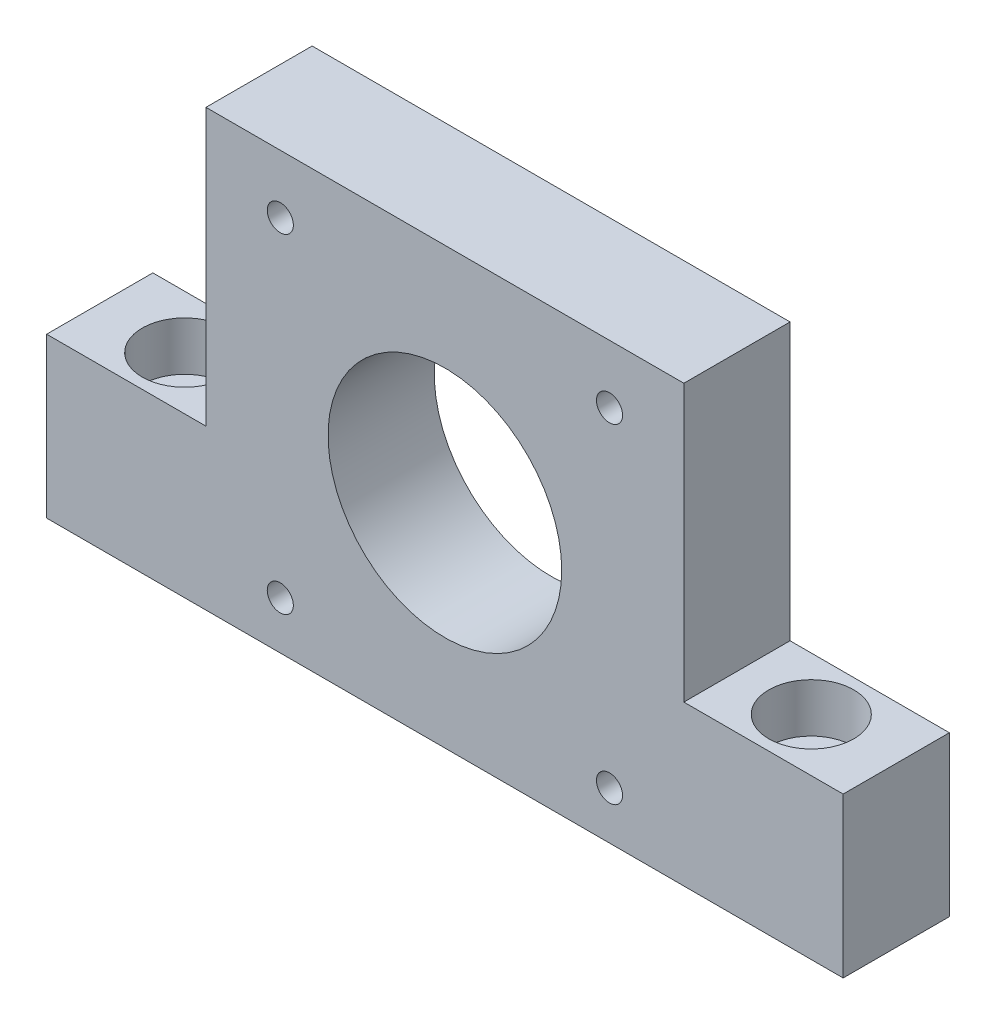
ISO-10303-21;
HEADER;
FILE_DESCRIPTION(('STEP AP214'),'2;1');
FILE_NAME('part.step','',(''),(''),'','','');
FILE_SCHEMA(('AUTOMOTIVE_DESIGN { 1 0 10303 214 1 1 1 1 }'));
ENDSEC;
DATA;
#1=APPLICATION_CONTEXT('core data for automotive mechanical design processes');
#2=APPLICATION_PROTOCOL_DEFINITION('international standard','automotive_design',2000,#1);
#3=PRODUCT_CONTEXT('',#1,'mechanical');
#4=PRODUCT('Part','Part','',(#3));
#5=PRODUCT_RELATED_PRODUCT_CATEGORY('part','',(#4));
#6=PRODUCT_DEFINITION_FORMATION('','',#4);
#7=PRODUCT_DEFINITION_CONTEXT('part definition',#1,'design');
#8=PRODUCT_DEFINITION('design','',#6,#7);
#9=PRODUCT_DEFINITION_SHAPE('','',#8);
#10=(LENGTH_UNIT() NAMED_UNIT(*) SI_UNIT(.MILLI.,.METRE.));
#11=(NAMED_UNIT(*) PLANE_ANGLE_UNIT() SI_UNIT($,.RADIAN.));
#12=(NAMED_UNIT(*) SI_UNIT($,.STERADIAN.) SOLID_ANGLE_UNIT());
#13=UNCERTAINTY_MEASURE_WITH_UNIT(LENGTH_MEASURE(1.E-05),#10,'distance_accuracy_value','');
#14=(GEOMETRIC_REPRESENTATION_CONTEXT(3) GLOBAL_UNCERTAINTY_ASSIGNED_CONTEXT((#13)) GLOBAL_UNIT_ASSIGNED_CONTEXT((#10,
#11,#12)) REPRESENTATION_CONTEXT('',''));
#15=CARTESIAN_POINT('',(0.,0.,0.));
#16=DIRECTION('',(0.,0.,1.));
#17=DIRECTION('',(1.,0.,0.));
#18=AXIS2_PLACEMENT_3D('',#15,#16,#17);
#19=CARTESIAN_POINT('',(0.,15.,10.));
#20=DIRECTION('',(1.,0.,0.));
#21=DIRECTION('',(0.,1.,0.));
#22=AXIS2_PLACEMENT_3D('',#19,#20,#21);
#23=PLANE('',#22);
#24=DIRECTION('',(0.,-1.,0.));
#25=VECTOR('',#24,1.);
#26=CARTESIAN_POINT('',(0.,15.,0.));
#27=LINE('',#26,#25);
#28=CARTESIAN_POINT('',(0.,15.,0.));
#29=VERTEX_POINT('',#28);
#30=CARTESIAN_POINT('',(0.,0.,0.));
#31=VERTEX_POINT('',#30);
#32=EDGE_CURVE('E135',#29,#31,#27,.T.);
#33=ORIENTED_EDGE('',*,*,#32,.T.);
#34=DIRECTION('',(0.,0.,-1.));
#35=VECTOR('',#34,1.);
#36=CARTESIAN_POINT('',(0.,0.,10.));
#37=LINE('',#36,#35);
#38=CARTESIAN_POINT('',(0.,0.,10.));
#39=VERTEX_POINT('',#38);
#40=EDGE_CURVE('E11',#39,#31,#37,.T.);
#41=ORIENTED_EDGE('',*,*,#40,.F.);
#42=DIRECTION('',(0.,-1.,0.));
#43=VECTOR('',#42,1.);
#44=CARTESIAN_POINT('',(0.,15.,10.));
#45=LINE('',#44,#43);
#46=CARTESIAN_POINT('',(0.,15.,10.));
#47=VERTEX_POINT('',#46);
#48=EDGE_CURVE('E150',#47,#39,#45,.T.);
#49=ORIENTED_EDGE('',*,*,#48,.F.);
#50=DIRECTION('',(0.,0.,-1.));
#51=VECTOR('',#50,1.);
#52=CARTESIAN_POINT('',(0.,15.,10.));
#53=LINE('',#52,#51);
#54=EDGE_CURVE('E131',#47,#29,#53,.T.);
#55=ORIENTED_EDGE('',*,*,#54,.T.);
#56=EDGE_LOOP('',(#33,#41,#49,#55));
#57=FACE_BOUND('',#56,.T.);
#58=ADVANCED_FACE('F39',(#57),#23,.F.);
#59=CARTESIAN_POINT('',(0.,0.,10.));
#60=DIRECTION('',(0.,1.,0.));
#61=DIRECTION('',(0.,0.,1.));
#62=AXIS2_PLACEMENT_3D('',#59,#60,#61);
#63=PLANE('',#62);
#64=CARTESIAN_POINT('',(7.99999999999999,0.,5.));
#65=DIRECTION('',(0.,1.,0.));
#66=DIRECTION('',(0.,0.,1.));
#67=AXIS2_PLACEMENT_3D('',#64,#65,#66);
#68=CIRCLE('',#67,2.25);
#69=CARTESIAN_POINT('',(7.99999999999999,0.,7.25));
#70=VERTEX_POINT('',#69);
#71=EDGE_CURVE('E200',#70,#70,#68,.T.);
#72=ORIENTED_EDGE('',*,*,#71,.T.);
#73=EDGE_LOOP('',(#72));
#74=FACE_BOUND('',#73,.T.);
#75=CARTESIAN_POINT('',(67.,0.,5.));
#76=DIRECTION('',(0.,1.,0.));
#77=DIRECTION('',(0.,0.,1.));
#78=AXIS2_PLACEMENT_3D('',#75,#76,#77);
#79=CIRCLE('',#78,2.25);
#80=CARTESIAN_POINT('',(67.,0.,7.25));
#81=VERTEX_POINT('',#80);
#82=EDGE_CURVE('E186',#81,#81,#79,.T.);
#83=ORIENTED_EDGE('',*,*,#82,.T.);
#84=EDGE_LOOP('',(#83));
#85=FACE_BOUND('',#84,.T.);
#86=DIRECTION('',(1.,0.,0.));
#87=VECTOR('',#86,1.);
#88=CARTESIAN_POINT('',(0.,0.,0.));
#89=LINE('',#88,#87);
#90=CARTESIAN_POINT('',(75.,0.,0.));
#91=VERTEX_POINT('',#90);
#92=EDGE_CURVE('E138',#31,#91,#89,.T.);
#93=ORIENTED_EDGE('',*,*,#92,.T.);
#94=DIRECTION('',(0.,0.,-1.));
#95=VECTOR('',#94,1.);
#96=CARTESIAN_POINT('',(75.,0.,10.));
#97=LINE('',#96,#95);
#98=CARTESIAN_POINT('',(75.,0.,10.));
#99=VERTEX_POINT('',#98);
#100=EDGE_CURVE('E47',#99,#91,#97,.T.);
#101=ORIENTED_EDGE('',*,*,#100,.F.);
#102=DIRECTION('',(1.,0.,0.));
#103=VECTOR('',#102,1.);
#104=CARTESIAN_POINT('',(0.,0.,10.));
#105=LINE('',#104,#103);
#106=EDGE_CURVE('E98',#39,#99,#105,.T.);
#107=ORIENTED_EDGE('',*,*,#106,.F.);
#108=ORIENTED_EDGE('',*,*,#40,.T.);
#109=EDGE_LOOP('',(#93,#101,#107,#108));
#110=FACE_BOUND('',#109,.T.);
#111=ADVANCED_FACE('F265',(#74,#85,#110),#63,.F.);
#112=CARTESIAN_POINT('',(75.,0.,10.));
#113=DIRECTION('',(-1.,0.,0.));
#114=DIRECTION('',(0.,0.,1.));
#115=AXIS2_PLACEMENT_3D('',#112,#113,#114);
#116=PLANE('',#115);
#117=DIRECTION('',(0.,1.,0.));
#118=VECTOR('',#117,1.);
#119=CARTESIAN_POINT('',(75.,0.,0.));
#120=LINE('',#119,#118);
#121=CARTESIAN_POINT('',(75.,15.,0.));
#122=VERTEX_POINT('',#121);
#123=EDGE_CURVE('E141',#91,#122,#120,.T.);
#124=ORIENTED_EDGE('',*,*,#123,.T.);
#125=DIRECTION('',(0.,0.,-1.));
#126=VECTOR('',#125,1.);
#127=CARTESIAN_POINT('',(75.,15.,10.));
#128=LINE('',#127,#126);
#129=CARTESIAN_POINT('',(75.,15.,10.));
#130=VERTEX_POINT('',#129);
#131=EDGE_CURVE('E157',#130,#122,#128,.T.);
#132=ORIENTED_EDGE('',*,*,#131,.F.);
#133=DIRECTION('',(0.,1.,0.));
#134=VECTOR('',#133,1.);
#135=CARTESIAN_POINT('',(75.,0.,10.));
#136=LINE('',#135,#134);
#137=EDGE_CURVE('E165',#99,#130,#136,.T.);
#138=ORIENTED_EDGE('',*,*,#137,.F.);
#139=ORIENTED_EDGE('',*,*,#100,.T.);
#140=EDGE_LOOP('',(#124,#132,#138,#139));
#141=FACE_BOUND('',#140,.T.);
#142=ADVANCED_FACE('F163',(#141),#116,.F.);
#143=CARTESIAN_POINT('',(75.,15.,10.));
#144=DIRECTION('',(0.,-1.,0.));
#145=DIRECTION('',(1.,0.,0.));
#146=AXIS2_PLACEMENT_3D('',#143,#144,#145);
#147=PLANE('',#146);
#148=CARTESIAN_POINT('',(67.,15.,5.));
#149=DIRECTION('',(0.,1.,0.));
#150=DIRECTION('',(0.,0.,1.));
#151=AXIS2_PLACEMENT_3D('',#148,#149,#150);
#152=CIRCLE('',#151,4.);
#153=CARTESIAN_POINT('',(67.,15.,9.00000000000001));
#154=VERTEX_POINT('',#153);
#155=EDGE_CURVE('E197',#154,#154,#152,.T.);
#156=ORIENTED_EDGE('',*,*,#155,.F.);
#157=EDGE_LOOP('',(#156));
#158=FACE_BOUND('',#157,.T.);
#159=DIRECTION('',(-1.,0.,0.));
#160=VECTOR('',#159,1.);
#161=CARTESIAN_POINT('',(75.,15.,0.));
#162=LINE('',#161,#160);
#163=CARTESIAN_POINT('',(60.,15.,0.));
#164=VERTEX_POINT('',#163);
#165=EDGE_CURVE('E143',#122,#164,#162,.T.);
#166=ORIENTED_EDGE('',*,*,#165,.T.);
#167=DIRECTION('',(0.,0.,-1.));
#168=VECTOR('',#167,1.);
#169=CARTESIAN_POINT('',(60.,15.,10.));
#170=LINE('',#169,#168);
#171=CARTESIAN_POINT('',(60.,15.,10.));
#172=VERTEX_POINT('',#171);
#173=EDGE_CURVE('E154',#172,#164,#170,.T.);
#174=ORIENTED_EDGE('',*,*,#173,.F.);
#175=DIRECTION('',(-1.,0.,0.));
#176=VECTOR('',#175,1.);
#177=CARTESIAN_POINT('',(75.,15.,10.));
#178=LINE('',#177,#176);
#179=EDGE_CURVE('E177',#130,#172,#178,.T.);
#180=ORIENTED_EDGE('',*,*,#179,.F.);
#181=ORIENTED_EDGE('',*,*,#131,.T.);
#182=EDGE_LOOP('',(#166,#174,#180,#181));
#183=FACE_BOUND('',#182,.T.);
#184=ADVANCED_FACE('F173',(#158,#183),#147,.F.);
#185=CARTESIAN_POINT('',(60.,15.,10.));
#186=DIRECTION('',(-1.,0.,0.));
#187=DIRECTION('',(0.,0.,1.));
#188=AXIS2_PLACEMENT_3D('',#185,#186,#187);
#189=PLANE('',#188);
#190=DIRECTION('',(0.,1.,0.));
#191=VECTOR('',#190,1.);
#192=CARTESIAN_POINT('',(60.,15.,0.));
#193=LINE('',#192,#191);
#194=CARTESIAN_POINT('',(60.,41.,0.));
#195=VERTEX_POINT('',#194);
#196=EDGE_CURVE('E145',#164,#195,#193,.T.);
#197=ORIENTED_EDGE('',*,*,#196,.T.);
#198=DIRECTION('',(0.,0.,-1.));
#199=VECTOR('',#198,1.);
#200=CARTESIAN_POINT('',(60.,41.,10.));
#201=LINE('',#200,#199);
#202=CARTESIAN_POINT('',(60.,41.,10.));
#203=VERTEX_POINT('',#202);
#204=EDGE_CURVE('E126',#203,#195,#201,.T.);
#205=ORIENTED_EDGE('',*,*,#204,.F.);
#206=DIRECTION('',(0.,1.,0.));
#207=VECTOR('',#206,1.);
#208=CARTESIAN_POINT('',(60.,15.,10.));
#209=LINE('',#208,#207);
#210=EDGE_CURVE('E117',#172,#203,#209,.T.);
#211=ORIENTED_EDGE('',*,*,#210,.F.);
#212=ORIENTED_EDGE('',*,*,#173,.T.);
#213=EDGE_LOOP('',(#197,#205,#211,#212));
#214=FACE_BOUND('',#213,.T.);
#215=ADVANCED_FACE('F176',(#214),#189,.F.);
#216=CARTESIAN_POINT('',(60.,41.,10.));
#217=DIRECTION('',(0.,-1.,0.));
#218=DIRECTION('',(0.,0.,-1.));
#219=AXIS2_PLACEMENT_3D('',#216,#217,#218);
#220=PLANE('',#219);
#221=DIRECTION('',(-1.,0.,0.));
#222=VECTOR('',#221,1.);
#223=CARTESIAN_POINT('',(60.,41.,0.));
#224=LINE('',#223,#222);
#225=CARTESIAN_POINT('',(15.,41.,0.));
#226=VERTEX_POINT('',#225);
#227=EDGE_CURVE('E125',#195,#226,#224,.T.);
#228=ORIENTED_EDGE('',*,*,#227,.T.);
#229=DIRECTION('',(0.,0.,-1.));
#230=VECTOR('',#229,1.);
#231=CARTESIAN_POINT('',(15.,41.,10.));
#232=LINE('',#231,#230);
#233=CARTESIAN_POINT('',(15.,41.,10.));
#234=VERTEX_POINT('',#233);
#235=EDGE_CURVE('E122',#234,#226,#232,.T.);
#236=ORIENTED_EDGE('',*,*,#235,.F.);
#237=DIRECTION('',(-1.,0.,0.));
#238=VECTOR('',#237,1.);
#239=CARTESIAN_POINT('',(60.,41.,10.));
#240=LINE('',#239,#238);
#241=EDGE_CURVE('E111',#203,#234,#240,.T.);
#242=ORIENTED_EDGE('',*,*,#241,.F.);
#243=ORIENTED_EDGE('',*,*,#204,.T.);
#244=EDGE_LOOP('',(#228,#236,#242,#243));
#245=FACE_BOUND('',#244,.T.);
#246=ADVANCED_FACE('F123',(#245),#220,.F.);
#247=CARTESIAN_POINT('',(15.,41.,10.));
#248=DIRECTION('',(1.,0.,0.));
#249=DIRECTION('',(0.,1.,0.));
#250=AXIS2_PLACEMENT_3D('',#247,#248,#249);
#251=PLANE('',#250);
#252=DIRECTION('',(0.,-1.,0.));
#253=VECTOR('',#252,1.);
#254=CARTESIAN_POINT('',(15.,41.,0.));
#255=LINE('',#254,#253);
#256=CARTESIAN_POINT('',(15.,15.,0.));
#257=VERTEX_POINT('',#256);
#258=EDGE_CURVE('E84',#226,#257,#255,.T.);
#259=ORIENTED_EDGE('',*,*,#258,.T.);
#260=DIRECTION('',(0.,0.,-1.));
#261=VECTOR('',#260,1.);
#262=CARTESIAN_POINT('',(15.,15.,10.));
#263=LINE('',#262,#261);
#264=CARTESIAN_POINT('',(15.,15.,10.));
#265=VERTEX_POINT('',#264);
#266=EDGE_CURVE('E127',#265,#257,#263,.T.);
#267=ORIENTED_EDGE('',*,*,#266,.F.);
#268=DIRECTION('',(0.,-1.,0.));
#269=VECTOR('',#268,1.);
#270=CARTESIAN_POINT('',(15.,41.,10.));
#271=LINE('',#270,#269);
#272=EDGE_CURVE('E115',#234,#265,#271,.T.);
#273=ORIENTED_EDGE('',*,*,#272,.F.);
#274=ORIENTED_EDGE('',*,*,#235,.T.);
#275=EDGE_LOOP('',(#259,#267,#273,#274));
#276=FACE_BOUND('',#275,.T.);
#277=ADVANCED_FACE('F129',(#276),#251,.F.);
#278=CARTESIAN_POINT('',(15.,15.,10.));
#279=DIRECTION('',(0.,-1.,0.));
#280=DIRECTION('',(1.,0.,0.));
#281=AXIS2_PLACEMENT_3D('',#278,#279,#280);
#282=PLANE('',#281);
#283=CARTESIAN_POINT('',(7.99999999999999,15.,5.));
#284=DIRECTION('',(0.,1.,0.));
#285=DIRECTION('',(0.,0.,1.));
#286=AXIS2_PLACEMENT_3D('',#283,#284,#285);
#287=CIRCLE('',#286,4.);
#288=CARTESIAN_POINT('',(7.99999999999999,15.,9.));
#289=VERTEX_POINT('',#288);
#290=EDGE_CURVE('E209',#289,#289,#287,.T.);
#291=ORIENTED_EDGE('',*,*,#290,.F.);
#292=EDGE_LOOP('',(#291));
#293=FACE_BOUND('',#292,.T.);
#294=DIRECTION('',(-1.,0.,0.));
#295=VECTOR('',#294,1.);
#296=CARTESIAN_POINT('',(15.,15.,0.));
#297=LINE('',#296,#295);
#298=EDGE_CURVE('E90',#257,#29,#297,.T.);
#299=ORIENTED_EDGE('',*,*,#298,.T.);
#300=ORIENTED_EDGE('',*,*,#54,.F.);
#301=DIRECTION('',(-1.,0.,0.));
#302=VECTOR('',#301,1.);
#303=CARTESIAN_POINT('',(15.,15.,10.));
#304=LINE('',#303,#302);
#305=EDGE_CURVE('E55',#265,#47,#304,.T.);
#306=ORIENTED_EDGE('',*,*,#305,.F.);
#307=ORIENTED_EDGE('',*,*,#266,.T.);
#308=EDGE_LOOP('',(#299,#300,#306,#307));
#309=FACE_BOUND('',#308,.T.);
#310=ADVANCED_FACE('F255',(#293,#309),#282,.F.);
#311=CARTESIAN_POINT('',(0.,0.,10.));
#312=DIRECTION('',(0.,0.,1.));
#313=DIRECTION('',(1.,0.,0.));
#314=AXIS2_PLACEMENT_3D('',#311,#312,#313);
#315=PLANE('',#314);
#316=CARTESIAN_POINT('',(21.9999999999984,35.4999999999964,10.));
#317=DIRECTION('',(0.,0.,-1.));
#318=DIRECTION('',(1.,0.,0.));
#319=AXIS2_PLACEMENT_3D('',#316,#317,#318);
#320=CIRCLE('',#319,1.22950000000004);
#321=CARTESIAN_POINT('',(23.2294999999984,35.4999999999964,10.));
#322=VERTEX_POINT('',#321);
#323=EDGE_CURVE('E219',#322,#322,#320,.T.);
#324=ORIENTED_EDGE('',*,*,#323,.T.);
#325=EDGE_LOOP('',(#324));
#326=FACE_BOUND('',#325,.T.);
#327=CARTESIAN_POINT('',(52.9999999999976,35.4999999999964,10.));
#328=DIRECTION('',(0.,0.,-1.));
#329=DIRECTION('',(-1.,0.,0.));
#330=AXIS2_PLACEMENT_3D('',#327,#328,#329);
#331=CIRCLE('',#330,1.22950000000005);
#332=CARTESIAN_POINT('',(51.7704999999976,35.4999999999964,10.));
#333=VERTEX_POINT('',#332);
#334=EDGE_CURVE('E225',#333,#333,#331,.T.);
#335=ORIENTED_EDGE('',*,*,#334,.T.);
#336=EDGE_LOOP('',(#335));
#337=FACE_BOUND('',#336,.T.);
#338=CARTESIAN_POINT('',(52.9999999999976,4.49999999999687,10.));
#339=DIRECTION('',(0.,0.,-1.));
#340=DIRECTION('',(1.,0.,0.));
#341=AXIS2_PLACEMENT_3D('',#338,#339,#340);
#342=CIRCLE('',#341,1.22950000000005);
#343=CARTESIAN_POINT('',(54.2294999999976,4.49999999999687,10.));
#344=VERTEX_POINT('',#343);
#345=EDGE_CURVE('E231',#344,#344,#342,.T.);
#346=ORIENTED_EDGE('',*,*,#345,.T.);
#347=EDGE_LOOP('',(#346));
#348=FACE_BOUND('',#347,.T.);
#349=CARTESIAN_POINT('',(21.9999999999984,4.49999999999687,10.));
#350=DIRECTION('',(0.,0.,-1.));
#351=DIRECTION('',(-1.,0.,0.));
#352=AXIS2_PLACEMENT_3D('',#349,#350,#351);
#353=CIRCLE('',#352,1.22950000000004);
#354=CARTESIAN_POINT('',(20.7704999999983,4.49999999999687,10.));
#355=VERTEX_POINT('',#354);
#356=EDGE_CURVE('E212',#355,#355,#353,.T.);
#357=ORIENTED_EDGE('',*,*,#356,.T.);
#358=EDGE_LOOP('',(#357));
#359=FACE_BOUND('',#358,.T.);
#360=CARTESIAN_POINT('',(37.5,20.,10.));
#361=DIRECTION('',(0.,0.,1.));
#362=DIRECTION('',(1.,0.,0.));
#363=AXIS2_PLACEMENT_3D('',#360,#361,#362);
#364=CIRCLE('',#363,11.);
#365=CARTESIAN_POINT('',(48.5,20.,10.));
#366=VERTEX_POINT('',#365);
#367=EDGE_CURVE('E183',#366,#366,#364,.T.);
#368=ORIENTED_EDGE('',*,*,#367,.F.);
#369=EDGE_LOOP('',(#368));
#370=FACE_BOUND('',#369,.T.);
#371=ORIENTED_EDGE('',*,*,#48,.T.);
#372=ORIENTED_EDGE('',*,*,#106,.T.);
#373=ORIENTED_EDGE('',*,*,#137,.T.);
#374=ORIENTED_EDGE('',*,*,#179,.T.);
#375=ORIENTED_EDGE('',*,*,#210,.T.);
#376=ORIENTED_EDGE('',*,*,#241,.T.);
#377=ORIENTED_EDGE('',*,*,#272,.T.);
#378=ORIENTED_EDGE('',*,*,#305,.T.);
#379=EDGE_LOOP('',(#371,#372,#373,#374,#375,#376,#377,#378));
#380=FACE_BOUND('',#379,.T.);
#381=ADVANCED_FACE('F113',(#326,#337,#348,#359,#370,#380),#315,.T.);
#382=CARTESIAN_POINT('',(0.,0.,0.));
#383=DIRECTION('',(0.,0.,1.));
#384=DIRECTION('',(1.,0.,0.));
#385=AXIS2_PLACEMENT_3D('',#382,#383,#384);
#386=PLANE('',#385);
#387=CARTESIAN_POINT('',(21.9999999999984,35.4999999999964,0.));
#388=DIRECTION('',(0.,0.,-1.));
#389=DIRECTION('',(1.,0.,0.));
#390=AXIS2_PLACEMENT_3D('',#387,#388,#389);
#391=CIRCLE('',#390,1.22950000000004);
#392=CARTESIAN_POINT('',(23.2294999999984,35.4999999999964,0.));
#393=VERTEX_POINT('',#392);
#394=EDGE_CURVE('E222',#393,#393,#391,.T.);
#395=ORIENTED_EDGE('',*,*,#394,.F.);
#396=EDGE_LOOP('',(#395));
#397=FACE_BOUND('',#396,.T.);
#398=CARTESIAN_POINT('',(52.9999999999976,35.4999999999964,0.));
#399=DIRECTION('',(0.,0.,-1.));
#400=DIRECTION('',(-1.,0.,0.));
#401=AXIS2_PLACEMENT_3D('',#398,#399,#400);
#402=CIRCLE('',#401,1.22950000000005);
#403=CARTESIAN_POINT('',(51.7704999999976,35.4999999999964,0.));
#404=VERTEX_POINT('',#403);
#405=EDGE_CURVE('E228',#404,#404,#402,.T.);
#406=ORIENTED_EDGE('',*,*,#405,.F.);
#407=EDGE_LOOP('',(#406));
#408=FACE_BOUND('',#407,.T.);
#409=CARTESIAN_POINT('',(52.9999999999976,4.49999999999687,0.));
#410=DIRECTION('',(0.,0.,-1.));
#411=DIRECTION('',(1.,0.,0.));
#412=AXIS2_PLACEMENT_3D('',#409,#410,#411);
#413=CIRCLE('',#412,1.22950000000005);
#414=CARTESIAN_POINT('',(54.2294999999976,4.49999999999687,0.));
#415=VERTEX_POINT('',#414);
#416=EDGE_CURVE('E216',#415,#415,#413,.T.);
#417=ORIENTED_EDGE('',*,*,#416,.F.);
#418=EDGE_LOOP('',(#417));
#419=FACE_BOUND('',#418,.T.);
#420=CARTESIAN_POINT('',(21.9999999999984,4.49999999999687,0.));
#421=DIRECTION('',(0.,0.,-1.));
#422=DIRECTION('',(-1.,0.,0.));
#423=AXIS2_PLACEMENT_3D('',#420,#421,#422);
#424=CIRCLE('',#423,1.22950000000004);
#425=CARTESIAN_POINT('',(20.7704999999983,4.49999999999687,0.));
#426=VERTEX_POINT('',#425);
#427=EDGE_CURVE('E213',#426,#426,#424,.T.);
#428=ORIENTED_EDGE('',*,*,#427,.F.);
#429=EDGE_LOOP('',(#428));
#430=FACE_BOUND('',#429,.T.);
#431=CARTESIAN_POINT('',(37.5,20.,0.));
#432=DIRECTION('',(0.,0.,1.));
#433=DIRECTION('',(1.,0.,0.));
#434=AXIS2_PLACEMENT_3D('',#431,#432,#433);
#435=CIRCLE('',#434,11.);
#436=CARTESIAN_POINT('',(48.5,20.,0.));
#437=VERTEX_POINT('',#436);
#438=EDGE_CURVE('E139',#437,#437,#435,.T.);
#439=ORIENTED_EDGE('',*,*,#438,.T.);
#440=EDGE_LOOP('',(#439));
#441=FACE_BOUND('',#440,.T.);
#442=ORIENTED_EDGE('',*,*,#32,.F.);
#443=ORIENTED_EDGE('',*,*,#298,.F.);
#444=ORIENTED_EDGE('',*,*,#258,.F.);
#445=ORIENTED_EDGE('',*,*,#227,.F.);
#446=ORIENTED_EDGE('',*,*,#196,.F.);
#447=ORIENTED_EDGE('',*,*,#165,.F.);
#448=ORIENTED_EDGE('',*,*,#123,.F.);
#449=ORIENTED_EDGE('',*,*,#92,.F.);
#450=EDGE_LOOP('',(#442,#443,#444,#445,#446,#447,#448,#449));
#451=FACE_BOUND('',#450,.T.);
#452=ADVANCED_FACE('F169',(#397,#408,#419,#430,#441,#451),#386,.F.);
#453=CARTESIAN_POINT('',(37.5,20.,0.));
#454=DIRECTION('',(0.,0.,1.));
#455=DIRECTION('',(1.,0.,0.));
#456=AXIS2_PLACEMENT_3D('',#453,#454,#455);
#457=CYLINDRICAL_SURFACE('',#456,11.);
#458=ORIENTED_EDGE('',*,*,#438,.F.);
#459=EDGE_LOOP('',(#458));
#460=FACE_BOUND('',#459,.T.);
#461=ORIENTED_EDGE('',*,*,#367,.T.);
#462=EDGE_LOOP('',(#461));
#463=FACE_BOUND('',#462,.T.);
#464=ADVANCED_FACE('F241',(#460,#463),#457,.F.);
#465=CARTESIAN_POINT('',(67.,15.,5.));
#466=DIRECTION('',(0.,1.,0.));
#467=DIRECTION('',(0.,0.,1.));
#468=AXIS2_PLACEMENT_3D('',#465,#466,#467);
#469=CYLINDRICAL_SURFACE('',#468,2.25);
#470=ORIENTED_EDGE('',*,*,#82,.F.);
#471=EDGE_LOOP('',(#470));
#472=FACE_BOUND('',#471,.T.);
#473=CARTESIAN_POINT('',(67.,10.4,5.));
#474=DIRECTION('',(0.,1.,0.));
#475=DIRECTION('',(0.,0.,1.));
#476=AXIS2_PLACEMENT_3D('',#473,#474,#475);
#477=CIRCLE('',#476,2.25);
#478=CARTESIAN_POINT('',(67.,10.4,7.25));
#479=VERTEX_POINT('',#478);
#480=EDGE_CURVE('E191',#479,#479,#477,.T.);
#481=ORIENTED_EDGE('',*,*,#480,.T.);
#482=EDGE_LOOP('',(#481));
#483=FACE_BOUND('',#482,.T.);
#484=ADVANCED_FACE('F250',(#472,#483),#469,.F.);
#485=CARTESIAN_POINT('',(69.25,10.4,5.));
#486=DIRECTION('',(0.,-1.,0.));
#487=DIRECTION('',(0.,0.,-1.));
#488=AXIS2_PLACEMENT_3D('',#485,#486,#487);
#489=PLANE('',#488);
#490=ORIENTED_EDGE('',*,*,#480,.F.);
#491=EDGE_LOOP('',(#490));
#492=FACE_BOUND('',#491,.T.);
#493=CARTESIAN_POINT('',(67.,10.4,5.));
#494=DIRECTION('',(0.,1.,0.));
#495=DIRECTION('',(0.,0.,1.));
#496=AXIS2_PLACEMENT_3D('',#493,#494,#495);
#497=CIRCLE('',#496,4.);
#498=CARTESIAN_POINT('',(67.,10.4,9.00000000000001));
#499=VERTEX_POINT('',#498);
#500=EDGE_CURVE('E194',#499,#499,#497,.T.);
#501=ORIENTED_EDGE('',*,*,#500,.T.);
#502=EDGE_LOOP('',(#501));
#503=FACE_BOUND('',#502,.T.);
#504=ADVANCED_FACE('F310',(#492,#503),#489,.F.);
#505=CARTESIAN_POINT('',(67.,15.,5.));
#506=DIRECTION('',(0.,1.,0.));
#507=DIRECTION('',(0.,0.,1.));
#508=AXIS2_PLACEMENT_3D('',#505,#506,#507);
#509=CYLINDRICAL_SURFACE('',#508,4.);
#510=ORIENTED_EDGE('',*,*,#500,.F.);
#511=EDGE_LOOP('',(#510));
#512=FACE_BOUND('',#511,.T.);
#513=ORIENTED_EDGE('',*,*,#155,.T.);
#514=EDGE_LOOP('',(#513));
#515=FACE_BOUND('',#514,.T.);
#516=ADVANCED_FACE('F322',(#512,#515),#509,.F.);
#517=CARTESIAN_POINT('',(7.99999999999999,15.,5.));
#518=DIRECTION('',(0.,1.,0.));
#519=DIRECTION('',(0.,0.,1.));
#520=AXIS2_PLACEMENT_3D('',#517,#518,#519);
#521=CYLINDRICAL_SURFACE('',#520,2.25);
#522=ORIENTED_EDGE('',*,*,#71,.F.);
#523=EDGE_LOOP('',(#522));
#524=FACE_BOUND('',#523,.T.);
#525=CARTESIAN_POINT('',(7.99999999999999,10.4,5.));
#526=DIRECTION('',(0.,1.,0.));
#527=DIRECTION('',(0.,0.,1.));
#528=AXIS2_PLACEMENT_3D('',#525,#526,#527);
#529=CIRCLE('',#528,2.25);
#530=CARTESIAN_POINT('',(7.99999999999999,10.4,7.25));
#531=VERTEX_POINT('',#530);
#532=EDGE_CURVE('E203',#531,#531,#529,.T.);
#533=ORIENTED_EDGE('',*,*,#532,.T.);
#534=EDGE_LOOP('',(#533));
#535=FACE_BOUND('',#534,.T.);
#536=ADVANCED_FACE('F333',(#524,#535),#521,.F.);
#537=CARTESIAN_POINT('',(10.25,10.4,5.));
#538=DIRECTION('',(0.,-1.,0.));
#539=DIRECTION('',(0.,0.,-1.));
#540=AXIS2_PLACEMENT_3D('',#537,#538,#539);
#541=PLANE('',#540);
#542=ORIENTED_EDGE('',*,*,#532,.F.);
#543=EDGE_LOOP('',(#542));
#544=FACE_BOUND('',#543,.T.);
#545=CARTESIAN_POINT('',(7.99999999999999,10.4,5.));
#546=DIRECTION('',(0.,1.,0.));
#547=DIRECTION('',(0.,0.,1.));
#548=AXIS2_PLACEMENT_3D('',#545,#546,#547);
#549=CIRCLE('',#548,4.);
#550=CARTESIAN_POINT('',(7.99999999999999,10.4,9.));
#551=VERTEX_POINT('',#550);
#552=EDGE_CURVE('E206',#551,#551,#549,.T.);
#553=ORIENTED_EDGE('',*,*,#552,.T.);
#554=EDGE_LOOP('',(#553));
#555=FACE_BOUND('',#554,.T.);
#556=ADVANCED_FACE('F344',(#544,#555),#541,.F.);
#557=CARTESIAN_POINT('',(7.99999999999999,15.,5.));
#558=DIRECTION('',(0.,1.,0.));
#559=DIRECTION('',(0.,0.,1.));
#560=AXIS2_PLACEMENT_3D('',#557,#558,#559);
#561=CYLINDRICAL_SURFACE('',#560,4.);
#562=ORIENTED_EDGE('',*,*,#552,.F.);
#563=EDGE_LOOP('',(#562));
#564=FACE_BOUND('',#563,.T.);
#565=ORIENTED_EDGE('',*,*,#290,.T.);
#566=EDGE_LOOP('',(#565));
#567=FACE_BOUND('',#566,.T.);
#568=ADVANCED_FACE('F355',(#564,#567),#561,.F.);
#569=CARTESIAN_POINT('',(21.9999999999984,4.49999999999687,10.));
#570=DIRECTION('',(0.,0.,-1.));
#571=DIRECTION('',(-1.,0.,0.));
#572=AXIS2_PLACEMENT_3D('',#569,#570,#571);
#573=CYLINDRICAL_SURFACE('',#572,1.22950000000004);
#574=ORIENTED_EDGE('',*,*,#356,.F.);
#575=EDGE_LOOP('',(#574));
#576=FACE_BOUND('',#575,.T.);
#577=ORIENTED_EDGE('',*,*,#427,.T.);
#578=EDGE_LOOP('',(#577));
#579=FACE_BOUND('',#578,.T.);
#580=ADVANCED_FACE('F365',(#576,#579),#573,.F.);
#581=CARTESIAN_POINT('',(52.9999999999976,4.49999999999687,10.));
#582=DIRECTION('',(0.,0.,-1.));
#583=DIRECTION('',(-1.,0.,0.));
#584=AXIS2_PLACEMENT_3D('',#581,#582,#583);
#585=CYLINDRICAL_SURFACE('',#584,1.22950000000005);
#586=ORIENTED_EDGE('',*,*,#345,.F.);
#587=EDGE_LOOP('',(#586));
#588=FACE_BOUND('',#587,.T.);
#589=ORIENTED_EDGE('',*,*,#416,.T.);
#590=EDGE_LOOP('',(#589));
#591=FACE_BOUND('',#590,.T.);
#592=ADVANCED_FACE('F237',(#588,#591),#585,.F.);
#593=CARTESIAN_POINT('',(52.9999999999976,35.4999999999964,10.));
#594=DIRECTION('',(0.,0.,-1.));
#595=DIRECTION('',(-1.,0.,0.));
#596=AXIS2_PLACEMENT_3D('',#593,#594,#595);
#597=CYLINDRICAL_SURFACE('',#596,1.22950000000005);
#598=ORIENTED_EDGE('',*,*,#334,.F.);
#599=EDGE_LOOP('',(#598));
#600=FACE_BOUND('',#599,.T.);
#601=ORIENTED_EDGE('',*,*,#405,.T.);
#602=EDGE_LOOP('',(#601));
#603=FACE_BOUND('',#602,.T.);
#604=ADVANCED_FACE('F398',(#600,#603),#597,.F.);
#605=CARTESIAN_POINT('',(21.9999999999984,35.4999999999964,10.));
#606=DIRECTION('',(0.,0.,-1.));
#607=DIRECTION('',(-1.,0.,0.));
#608=AXIS2_PLACEMENT_3D('',#605,#606,#607);
#609=CYLINDRICAL_SURFACE('',#608,1.22950000000004);
#610=ORIENTED_EDGE('',*,*,#323,.F.);
#611=EDGE_LOOP('',(#610));
#612=FACE_BOUND('',#611,.T.);
#613=ORIENTED_EDGE('',*,*,#394,.T.);
#614=EDGE_LOOP('',(#613));
#615=FACE_BOUND('',#614,.T.);
#616=ADVANCED_FACE('F409',(#612,#615),#609,.F.);
#617=CLOSED_SHELL('',(#58,#111,#142,#184,#215,#246,#277,#310,#381,#452,#464,#484,#504,#516,#536,
#556,#568,#580,#592,#604,#616));
#618=MANIFOLD_SOLID_BREP('B2',#617);
#619=ADVANCED_BREP_SHAPE_REPRESENTATION('',(#18,#618),#14);
#620=SHAPE_DEFINITION_REPRESENTATION(#9,#619);
ENDSEC;
END-ISO-10303-21;
